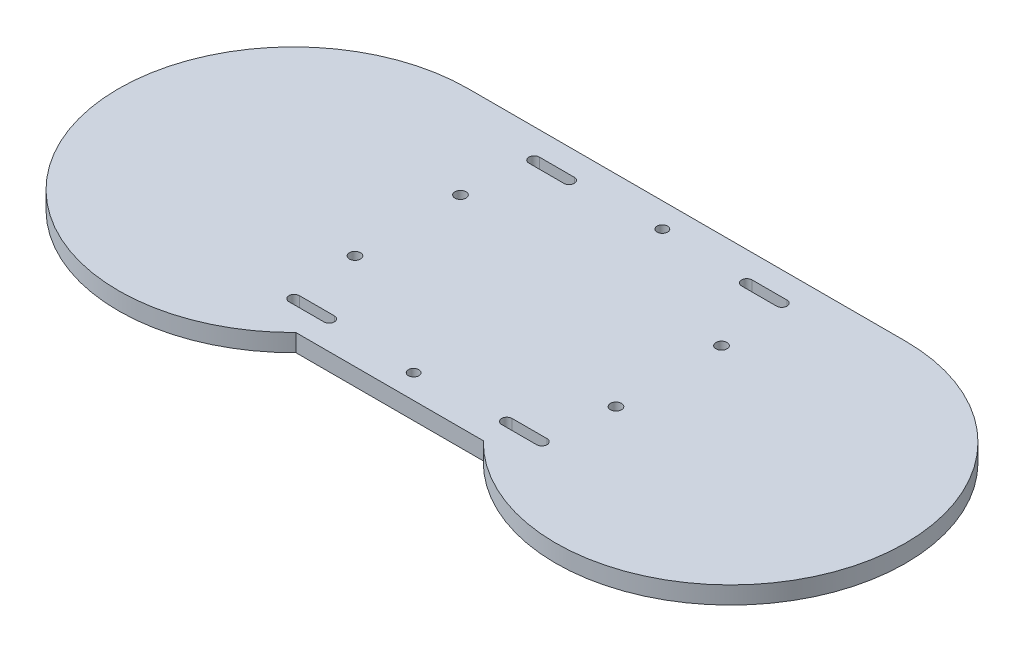
ISO-10303-21;
HEADER;
FILE_DESCRIPTION(('STEP AP214'),'2;1');
FILE_NAME('part.step','',(''),(''),'','','');
FILE_SCHEMA(('AUTOMOTIVE_DESIGN { 1 0 10303 214 1 1 1 1 }'));
ENDSEC;
DATA;
#1=APPLICATION_CONTEXT('core data for automotive mechanical design processes');
#2=APPLICATION_PROTOCOL_DEFINITION('international standard','automotive_design',2000,#1);
#3=PRODUCT_CONTEXT('',#1,'mechanical');
#4=PRODUCT('Part','Part','',(#3));
#5=PRODUCT_RELATED_PRODUCT_CATEGORY('part','',(#4));
#6=PRODUCT_DEFINITION_FORMATION('','',#4);
#7=PRODUCT_DEFINITION_CONTEXT('part definition',#1,'design');
#8=PRODUCT_DEFINITION('design','',#6,#7);
#9=PRODUCT_DEFINITION_SHAPE('','',#8);
#10=(LENGTH_UNIT() NAMED_UNIT(*) SI_UNIT(.MILLI.,.METRE.));
#11=(NAMED_UNIT(*) PLANE_ANGLE_UNIT() SI_UNIT($,.RADIAN.));
#12=(NAMED_UNIT(*) SI_UNIT($,.STERADIAN.) SOLID_ANGLE_UNIT());
#13=UNCERTAINTY_MEASURE_WITH_UNIT(LENGTH_MEASURE(1.E-05),#10,'distance_accuracy_value','');
#14=(GEOMETRIC_REPRESENTATION_CONTEXT(3) GLOBAL_UNCERTAINTY_ASSIGNED_CONTEXT((#13)) GLOBAL_UNIT_ASSIGNED_CONTEXT((#10,
#11,#12)) REPRESENTATION_CONTEXT('',''));
#15=CARTESIAN_POINT('',(0.,0.,0.));
#16=DIRECTION('',(0.,0.,1.));
#17=DIRECTION('',(1.,0.,0.));
#18=AXIS2_PLACEMENT_3D('',#15,#16,#17);
#19=CARTESIAN_POINT('',(-62.5,-13.1875,0.));
#20=DIRECTION('',(0.,-1.,0.));
#21=DIRECTION('',(0.,0.,-1.));
#22=AXIS2_PLACEMENT_3D('',#19,#20,#21);
#23=PLANE('',#22);
#24=DIRECTION('',(1.,0.,0.));
#25=VECTOR('',#24,1.);
#26=CARTESIAN_POINT('',(25.4,-13.1875,-40.2312608372554));
#27=LINE('',#26,#25);
#28=CARTESIAN_POINT('',(35.4,-13.1875,-40.2312608372554));
#29=VERTEX_POINT('',#28);
#30=CARTESIAN_POINT('',(25.4,-13.1875,-40.2312608372554));
#31=VERTEX_POINT('',#30);
#32=EDGE_CURVE('E223',#29,#31,#27,.F.);
#33=ORIENTED_EDGE('',*,*,#32,.F.);
#34=CARTESIAN_POINT('',(35.4,-13.1875,-41.7312608372554));
#35=DIRECTION('',(0.,-1.,0.));
#36=DIRECTION('',(0.,0.,-1.));
#37=AXIS2_PLACEMENT_3D('',#34,#35,#36);
#38=CIRCLE('',#37,1.5);
#39=CARTESIAN_POINT('',(35.4,-13.1875,-43.2312608372554));
#40=VERTEX_POINT('',#39);
#41=EDGE_CURVE('E241',#40,#29,#38,.T.);
#42=ORIENTED_EDGE('',*,*,#41,.F.);
#43=DIRECTION('',(-1.,0.,0.));
#44=VECTOR('',#43,1.);
#45=CARTESIAN_POINT('',(25.4,-13.1875,-43.2312608372554));
#46=LINE('',#45,#44);
#47=CARTESIAN_POINT('',(25.4,-13.1875,-43.2312608372554));
#48=VERTEX_POINT('',#47);
#49=EDGE_CURVE('E225',#48,#40,#46,.F.);
#50=ORIENTED_EDGE('',*,*,#49,.F.);
#51=CARTESIAN_POINT('',(25.4,-13.1875,-41.7312608372554));
#52=DIRECTION('',(0.,1.,0.));
#53=DIRECTION('',(0.,0.,1.));
#54=AXIS2_PLACEMENT_3D('',#51,#52,#53);
#55=CIRCLE('',#54,1.5);
#56=EDGE_CURVE('E47',#48,#31,#55,.T.);
#57=ORIENTED_EDGE('',*,*,#56,.T.);
#58=EDGE_LOOP('',(#33,#42,#50,#57));
#59=FACE_BOUND('',#58,.T.);
#60=DIRECTION('',(1.,0.,0.));
#61=VECTOR('',#60,1.);
#62=CARTESIAN_POINT('',(25.4,-13.1875,28.3687391627446));
#63=LINE('',#62,#61);
#64=CARTESIAN_POINT('',(35.4,-13.1875,28.3687391627446));
#65=VERTEX_POINT('',#64);
#66=CARTESIAN_POINT('',(25.4,-13.1875,28.3687391627446));
#67=VERTEX_POINT('',#66);
#68=EDGE_CURVE('E231',#65,#67,#63,.F.);
#69=ORIENTED_EDGE('',*,*,#68,.F.);
#70=CARTESIAN_POINT('',(35.4,-13.1875,26.8687391627446));
#71=DIRECTION('',(0.,-1.,0.));
#72=DIRECTION('',(0.,0.,-1.));
#73=AXIS2_PLACEMENT_3D('',#70,#71,#72);
#74=CIRCLE('',#73,1.5);
#75=CARTESIAN_POINT('',(35.4,-13.1875,25.3687391627446));
#76=VERTEX_POINT('',#75);
#77=EDGE_CURVE('E233',#76,#65,#74,.T.);
#78=ORIENTED_EDGE('',*,*,#77,.F.);
#79=DIRECTION('',(-1.,0.,0.));
#80=VECTOR('',#79,1.);
#81=CARTESIAN_POINT('',(25.4,-13.1875,25.3687391627446));
#82=LINE('',#81,#80);
#83=CARTESIAN_POINT('',(25.4,-13.1875,25.3687391627446));
#84=VERTEX_POINT('',#83);
#85=EDGE_CURVE('E237',#84,#76,#82,.F.);
#86=ORIENTED_EDGE('',*,*,#85,.F.);
#87=CARTESIAN_POINT('',(25.4,-13.1875,26.8687391627446));
#88=DIRECTION('',(0.,1.,0.));
#89=DIRECTION('',(0.,0.,1.));
#90=AXIS2_PLACEMENT_3D('',#87,#88,#89);
#91=CIRCLE('',#90,1.5);
#92=EDGE_CURVE('E236',#84,#67,#91,.T.);
#93=ORIENTED_EDGE('',*,*,#92,.T.);
#94=EDGE_LOOP('',(#69,#78,#86,#93));
#95=FACE_BOUND('',#94,.T.);
#96=DIRECTION('',(-1.,0.,0.));
#97=VECTOR('',#96,1.);
#98=CARTESIAN_POINT('',(-25.4,-13.1875,25.3687391627446));
#99=LINE('',#98,#97);
#100=CARTESIAN_POINT('',(-35.4,-13.1875,25.3687391627446));
#101=VERTEX_POINT('',#100);
#102=CARTESIAN_POINT('',(-25.4,-13.1875,25.3687391627446));
#103=VERTEX_POINT('',#102);
#104=EDGE_CURVE('E219',#101,#103,#99,.F.);
#105=ORIENTED_EDGE('',*,*,#104,.F.);
#106=CARTESIAN_POINT('',(-35.4,-13.1875,26.8687391627446));
#107=DIRECTION('',(0.,-1.,0.));
#108=DIRECTION('',(0.,0.,-1.));
#109=AXIS2_PLACEMENT_3D('',#106,#107,#108);
#110=CIRCLE('',#109,1.5);
#111=CARTESIAN_POINT('',(-35.4,-13.1875,28.3687391627446));
#112=VERTEX_POINT('',#111);
#113=EDGE_CURVE('E222',#112,#101,#110,.T.);
#114=ORIENTED_EDGE('',*,*,#113,.F.);
#115=DIRECTION('',(1.,0.,0.));
#116=VECTOR('',#115,1.);
#117=CARTESIAN_POINT('',(-25.4,-13.1875,28.3687391627446));
#118=LINE('',#117,#116);
#119=CARTESIAN_POINT('',(-25.4,-13.1875,28.3687391627446));
#120=VERTEX_POINT('',#119);
#121=EDGE_CURVE('E229',#120,#112,#118,.F.);
#122=ORIENTED_EDGE('',*,*,#121,.F.);
#123=CARTESIAN_POINT('',(-25.4,-13.1875,26.8687391627446));
#124=DIRECTION('',(0.,1.,0.));
#125=DIRECTION('',(0.,0.,1.));
#126=AXIS2_PLACEMENT_3D('',#123,#124,#125);
#127=CIRCLE('',#126,1.5);
#128=EDGE_CURVE('E192',#120,#103,#127,.T.);
#129=ORIENTED_EDGE('',*,*,#128,.T.);
#130=EDGE_LOOP('',(#105,#114,#122,#129));
#131=FACE_BOUND('',#130,.T.);
#132=DIRECTION('',(-1.,0.,0.));
#133=VECTOR('',#132,1.);
#134=CARTESIAN_POINT('',(-25.4,-13.1875,-43.2312608372554));
#135=LINE('',#134,#133);
#136=CARTESIAN_POINT('',(-35.4,-13.1875,-43.2312608372554));
#137=VERTEX_POINT('',#136);
#138=CARTESIAN_POINT('',(-25.4,-13.1875,-43.2312608372554));
#139=VERTEX_POINT('',#138);
#140=EDGE_CURVE('E218',#137,#139,#135,.F.);
#141=ORIENTED_EDGE('',*,*,#140,.F.);
#142=CARTESIAN_POINT('',(-35.4,-13.1875,-41.7312608372554));
#143=DIRECTION('',(0.,-1.,0.));
#144=DIRECTION('',(0.,0.,-1.));
#145=AXIS2_PLACEMENT_3D('',#142,#143,#144);
#146=CIRCLE('',#145,1.49999999999999);
#147=CARTESIAN_POINT('',(-35.4,-13.1875,-40.2312608372554));
#148=VERTEX_POINT('',#147);
#149=EDGE_CURVE('E220',#148,#137,#146,.T.);
#150=ORIENTED_EDGE('',*,*,#149,.F.);
#151=DIRECTION('',(1.,0.,0.));
#152=VECTOR('',#151,1.);
#153=CARTESIAN_POINT('',(-25.4,-13.1875,-40.2312608372554));
#154=LINE('',#153,#152);
#155=CARTESIAN_POINT('',(-25.4,-13.1875,-40.2312608372554));
#156=VERTEX_POINT('',#155);
#157=EDGE_CURVE('E216',#156,#148,#154,.F.);
#158=ORIENTED_EDGE('',*,*,#157,.F.);
#159=CARTESIAN_POINT('',(-25.4,-13.1875,-41.7312608372554));
#160=DIRECTION('',(0.,1.,0.));
#161=DIRECTION('',(0.,0.,1.));
#162=AXIS2_PLACEMENT_3D('',#159,#160,#161);
#163=CIRCLE('',#162,1.5);
#164=EDGE_CURVE('E226',#156,#139,#163,.T.);
#165=ORIENTED_EDGE('',*,*,#164,.T.);
#166=EDGE_LOOP('',(#141,#150,#158,#165));
#167=FACE_BOUND('',#166,.T.);
#168=CARTESIAN_POINT('',(0.,-13.1875,-42.9812608372554));
#169=DIRECTION('',(0.,1.,0.));
#170=DIRECTION('',(0.,0.,1.));
#171=AXIS2_PLACEMENT_3D('',#168,#169,#170);
#172=CIRCLE('',#171,1.5);
#173=CARTESIAN_POINT('',(0.,-13.1875,-41.4812608372554));
#174=VERTEX_POINT('',#173);
#175=EDGE_CURVE('E306',#174,#174,#172,.T.);
#176=ORIENTED_EDGE('',*,*,#175,.T.);
#177=EDGE_LOOP('',(#176));
#178=FACE_BOUND('',#177,.T.);
#179=CARTESIAN_POINT('',(0.,-13.1875,28.1187391627446));
#180=DIRECTION('',(0.,1.,0.));
#181=DIRECTION('',(0.,0.,1.));
#182=AXIS2_PLACEMENT_3D('',#179,#180,#181);
#183=CIRCLE('',#182,1.5);
#184=CARTESIAN_POINT('',(0.,-13.1875,29.6187391627446));
#185=VERTEX_POINT('',#184);
#186=EDGE_CURVE('E245',#185,#185,#183,.T.);
#187=ORIENTED_EDGE('',*,*,#186,.T.);
#188=EDGE_LOOP('',(#187));
#189=FACE_BOUND('',#188,.T.);
#190=CARTESIAN_POINT('',(37.30625,-13.1875,-22.58125));
#191=DIRECTION('',(0.,-1.,0.));
#192=DIRECTION('',(0.,0.,-1.));
#193=AXIS2_PLACEMENT_3D('',#190,#191,#192);
#194=CIRCLE('',#193,1.5875);
#195=CARTESIAN_POINT('',(37.30625,-13.1875,-24.16875));
#196=VERTEX_POINT('',#195);
#197=EDGE_CURVE('E317',#196,#196,#194,.T.);
#198=ORIENTED_EDGE('',*,*,#197,.F.);
#199=EDGE_LOOP('',(#198));
#200=FACE_BOUND('',#199,.T.);
#201=CARTESIAN_POINT('',(-37.30625,-13.1875,7.58125));
#202=DIRECTION('',(0.,-1.,0.));
#203=DIRECTION('',(0.,0.,-1.));
#204=AXIS2_PLACEMENT_3D('',#201,#202,#203);
#205=CIRCLE('',#204,1.5875);
#206=CARTESIAN_POINT('',(-37.30625,-13.1875,5.99375));
#207=VERTEX_POINT('',#206);
#208=EDGE_CURVE('E329',#207,#207,#205,.T.);
#209=ORIENTED_EDGE('',*,*,#208,.F.);
#210=EDGE_LOOP('',(#209));
#211=FACE_BOUND('',#210,.T.);
#212=CARTESIAN_POINT('',(-62.5,-13.1875,0.));
#213=DIRECTION('',(0.,-1.,0.));
#214=DIRECTION('',(0.,0.,-1.));
#215=AXIS2_PLACEMENT_3D('',#212,#213,#214);
#216=CIRCLE('',#215,50.);
#217=CARTESIAN_POINT('',(-26.7928578572857,-13.1875,35.));
#218=VERTEX_POINT('',#217);
#219=CARTESIAN_POINT('',(-62.5,-13.1875,-50.));
#220=VERTEX_POINT('',#219);
#221=EDGE_CURVE('E335',#218,#220,#216,.T.);
#222=ORIENTED_EDGE('',*,*,#221,.T.);
#223=DIRECTION('',(1.,0.,0.));
#224=VECTOR('',#223,1.);
#225=CARTESIAN_POINT('',(-62.5,-13.1875,-50.));
#226=LINE('',#225,#224);
#227=CARTESIAN_POINT('',(62.5,-13.1875,-50.));
#228=VERTEX_POINT('',#227);
#229=EDGE_CURVE('E338',#220,#228,#226,.T.);
#230=ORIENTED_EDGE('',*,*,#229,.T.);
#231=CARTESIAN_POINT('',(62.5,-13.1875,0.));
#232=DIRECTION('',(0.,-1.,0.));
#233=DIRECTION('',(0.,0.,-1.));
#234=AXIS2_PLACEMENT_3D('',#231,#232,#233);
#235=CIRCLE('',#234,50.);
#236=CARTESIAN_POINT('',(26.7928578572857,-13.1875,35.));
#237=VERTEX_POINT('',#236);
#238=EDGE_CURVE('E341',#228,#237,#235,.T.);
#239=ORIENTED_EDGE('',*,*,#238,.T.);
#240=DIRECTION('',(-1.,0.,0.));
#241=VECTOR('',#240,1.);
#242=CARTESIAN_POINT('',(-26.7928578572857,-13.1875,35.));
#243=LINE('',#242,#241);
#244=EDGE_CURVE('E343',#237,#218,#243,.T.);
#245=ORIENTED_EDGE('',*,*,#244,.T.);
#246=EDGE_LOOP('',(#222,#230,#239,#245));
#247=FACE_BOUND('',#246,.T.);
#248=CARTESIAN_POINT('',(37.30625,-13.1875,7.58125));
#249=DIRECTION('',(0.,-1.,0.));
#250=DIRECTION('',(0.,0.,-1.));
#251=AXIS2_PLACEMENT_3D('',#248,#249,#250);
#252=CIRCLE('',#251,1.5875);
#253=CARTESIAN_POINT('',(37.30625,-13.1875,5.99375));
#254=VERTEX_POINT('',#253);
#255=EDGE_CURVE('E323',#254,#254,#252,.T.);
#256=ORIENTED_EDGE('',*,*,#255,.F.);
#257=EDGE_LOOP('',(#256));
#258=FACE_BOUND('',#257,.T.);
#259=CARTESIAN_POINT('',(-37.30625,-13.1875,-22.58125));
#260=DIRECTION('',(0.,-1.,0.));
#261=DIRECTION('',(0.,0.,-1.));
#262=AXIS2_PLACEMENT_3D('',#259,#260,#261);
#263=CIRCLE('',#262,1.5875);
#264=CARTESIAN_POINT('',(-37.30625,-13.1875,-24.16875));
#265=VERTEX_POINT('',#264);
#266=EDGE_CURVE('E311',#265,#265,#263,.T.);
#267=ORIENTED_EDGE('',*,*,#266,.F.);
#268=EDGE_LOOP('',(#267));
#269=FACE_BOUND('',#268,.T.);
#270=ADVANCED_FACE('F43',(#59,#95,#131,#167,#178,#189,#200,#211,#247,#258,#269),#23,.T.);
#271=CARTESIAN_POINT('',(-62.5,-8.1875,0.));
#272=DIRECTION('',(0.,-1.,0.));
#273=DIRECTION('',(0.,0.,-1.));
#274=AXIS2_PLACEMENT_3D('',#271,#272,#273);
#275=PLANE('',#274);
#276=CARTESIAN_POINT('',(0.,-8.1875,-42.9812608372554));
#277=DIRECTION('',(0.,-1.,0.));
#278=DIRECTION('',(0.,0.,-1.));
#279=AXIS2_PLACEMENT_3D('',#276,#277,#278);
#280=CIRCLE('',#279,1.5);
#281=CARTESIAN_POINT('',(0.,-8.1875,-41.4812608372554));
#282=VERTEX_POINT('',#281);
#283=EDGE_CURVE('E212',#282,#282,#280,.T.);
#284=ORIENTED_EDGE('',*,*,#283,.T.);
#285=EDGE_LOOP('',(#284));
#286=FACE_BOUND('',#285,.T.);
#287=CARTESIAN_POINT('',(0.,-8.1875,28.1187391627446));
#288=DIRECTION('',(0.,-1.,0.));
#289=DIRECTION('',(0.,0.,-1.));
#290=AXIS2_PLACEMENT_3D('',#287,#288,#289);
#291=CIRCLE('',#290,1.5);
#292=CARTESIAN_POINT('',(0.,-8.1875,29.6187391627446));
#293=VERTEX_POINT('',#292);
#294=EDGE_CURVE('E203',#293,#293,#291,.T.);
#295=ORIENTED_EDGE('',*,*,#294,.T.);
#296=EDGE_LOOP('',(#295));
#297=FACE_BOUND('',#296,.T.);
#298=CARTESIAN_POINT('',(35.4,-8.1875,26.8687391627446));
#299=DIRECTION('',(0.,-1.,0.));
#300=DIRECTION('',(0.,0.,-1.));
#301=AXIS2_PLACEMENT_3D('',#298,#299,#300);
#302=CIRCLE('',#301,1.5);
#303=CARTESIAN_POINT('',(35.4,-8.1875,28.3687391627446));
#304=VERTEX_POINT('',#303);
#305=CARTESIAN_POINT('',(35.4,-8.1875,25.3687391627446));
#306=VERTEX_POINT('',#305);
#307=EDGE_CURVE('E274',#304,#306,#302,.F.);
#308=ORIENTED_EDGE('',*,*,#307,.F.);
#309=DIRECTION('',(1.,0.,0.));
#310=VECTOR('',#309,1.);
#311=CARTESIAN_POINT('',(25.4,-8.1875,28.3687391627446));
#312=LINE('',#311,#310);
#313=CARTESIAN_POINT('',(25.4,-8.1875,28.3687391627446));
#314=VERTEX_POINT('',#313);
#315=EDGE_CURVE('E674',#314,#304,#312,.T.);
#316=ORIENTED_EDGE('',*,*,#315,.F.);
#317=CARTESIAN_POINT('',(25.4,-8.1875,26.8687391627446));
#318=DIRECTION('',(0.,-1.,0.));
#319=DIRECTION('',(0.,0.,-1.));
#320=AXIS2_PLACEMENT_3D('',#317,#318,#319);
#321=CIRCLE('',#320,1.5);
#322=CARTESIAN_POINT('',(25.4,-8.1875,25.3687391627446));
#323=VERTEX_POINT('',#322);
#324=EDGE_CURVE('E199',#314,#323,#321,.T.);
#325=ORIENTED_EDGE('',*,*,#324,.T.);
#326=DIRECTION('',(-1.,0.,0.));
#327=VECTOR('',#326,1.);
#328=CARTESIAN_POINT('',(25.4,-8.1875,25.3687391627446));
#329=LINE('',#328,#327);
#330=EDGE_CURVE('E270',#306,#323,#329,.T.);
#331=ORIENTED_EDGE('',*,*,#330,.F.);
#332=EDGE_LOOP('',(#308,#316,#325,#331));
#333=FACE_BOUND('',#332,.T.);
#334=CARTESIAN_POINT('',(-35.4,-8.1875,26.8687391627446));
#335=DIRECTION('',(0.,-1.,0.));
#336=DIRECTION('',(0.,0.,-1.));
#337=AXIS2_PLACEMENT_3D('',#334,#335,#336);
#338=CIRCLE('',#337,1.5);
#339=CARTESIAN_POINT('',(-35.4,-8.1875,25.3687391627446));
#340=VERTEX_POINT('',#339);
#341=CARTESIAN_POINT('',(-35.4,-8.1875,28.3687391627446));
#342=VERTEX_POINT('',#341);
#343=EDGE_CURVE('E302',#340,#342,#338,.F.);
#344=ORIENTED_EDGE('',*,*,#343,.F.);
#345=DIRECTION('',(-1.,0.,0.));
#346=VECTOR('',#345,1.);
#347=CARTESIAN_POINT('',(-25.4,-8.1875,25.3687391627446));
#348=LINE('',#347,#346);
#349=CARTESIAN_POINT('',(-25.4,-8.1875,25.3687391627446));
#350=VERTEX_POINT('',#349);
#351=EDGE_CURVE('E181',#350,#340,#348,.T.);
#352=ORIENTED_EDGE('',*,*,#351,.F.);
#353=CARTESIAN_POINT('',(-25.4,-8.1875,26.8687391627446));
#354=DIRECTION('',(0.,-1.,0.));
#355=DIRECTION('',(0.,0.,-1.));
#356=AXIS2_PLACEMENT_3D('',#353,#354,#355);
#357=CIRCLE('',#356,1.5);
#358=CARTESIAN_POINT('',(-25.4,-8.1875,28.3687391627446));
#359=VERTEX_POINT('',#358);
#360=EDGE_CURVE('E190',#350,#359,#357,.T.);
#361=ORIENTED_EDGE('',*,*,#360,.T.);
#362=DIRECTION('',(1.,0.,0.));
#363=VECTOR('',#362,1.);
#364=CARTESIAN_POINT('',(-25.4,-8.1875,28.3687391627446));
#365=LINE('',#364,#363);
#366=EDGE_CURVE('E171',#342,#359,#365,.T.);
#367=ORIENTED_EDGE('',*,*,#366,.F.);
#368=EDGE_LOOP('',(#344,#352,#361,#367));
#369=FACE_BOUND('',#368,.T.);
#370=CARTESIAN_POINT('',(-35.4,-8.1875,-41.7312608372554));
#371=DIRECTION('',(0.,-1.,0.));
#372=DIRECTION('',(0.,0.,-1.));
#373=AXIS2_PLACEMENT_3D('',#370,#371,#372);
#374=CIRCLE('',#373,1.49999999999999);
#375=CARTESIAN_POINT('',(-35.4,-8.1875,-43.2312608372554));
#376=VERTEX_POINT('',#375);
#377=CARTESIAN_POINT('',(-35.4,-8.1875,-40.2312608372554));
#378=VERTEX_POINT('',#377);
#379=EDGE_CURVE('E281',#376,#378,#374,.F.);
#380=ORIENTED_EDGE('',*,*,#379,.F.);
#381=DIRECTION('',(-1.,0.,0.));
#382=VECTOR('',#381,1.);
#383=CARTESIAN_POINT('',(-25.4,-8.1875,-43.2312608372554));
#384=LINE('',#383,#382);
#385=CARTESIAN_POINT('',(-25.4,-8.1875,-43.2312608372554));
#386=VERTEX_POINT('',#385);
#387=EDGE_CURVE('E283',#386,#376,#384,.T.);
#388=ORIENTED_EDGE('',*,*,#387,.F.);
#389=CARTESIAN_POINT('',(-25.4,-8.1875,-41.7312608372554));
#390=DIRECTION('',(0.,-1.,0.));
#391=DIRECTION('',(0.,0.,-1.));
#392=AXIS2_PLACEMENT_3D('',#389,#390,#391);
#393=CIRCLE('',#392,1.5);
#394=CARTESIAN_POINT('',(-25.4,-8.1875,-40.2312608372554));
#395=VERTEX_POINT('',#394);
#396=EDGE_CURVE('E200',#386,#395,#393,.T.);
#397=ORIENTED_EDGE('',*,*,#396,.T.);
#398=DIRECTION('',(1.,0.,0.));
#399=VECTOR('',#398,1.);
#400=CARTESIAN_POINT('',(-25.4,-8.1875,-40.2312608372554));
#401=LINE('',#400,#399);
#402=EDGE_CURVE('E239',#378,#395,#401,.T.);
#403=ORIENTED_EDGE('',*,*,#402,.F.);
#404=EDGE_LOOP('',(#380,#388,#397,#403));
#405=FACE_BOUND('',#404,.T.);
#406=CARTESIAN_POINT('',(35.4,-8.1875,-41.7312608372554));
#407=DIRECTION('',(0.,-1.,0.));
#408=DIRECTION('',(0.,0.,-1.));
#409=AXIS2_PLACEMENT_3D('',#406,#407,#408);
#410=CIRCLE('',#409,1.5);
#411=CARTESIAN_POINT('',(35.4,-8.1875,-40.2312608372554));
#412=VERTEX_POINT('',#411);
#413=CARTESIAN_POINT('',(35.4,-8.1875,-43.2312608372554));
#414=VERTEX_POINT('',#413);
#415=EDGE_CURVE('E129',#412,#414,#410,.F.);
#416=ORIENTED_EDGE('',*,*,#415,.F.);
#417=DIRECTION('',(1.,0.,0.));
#418=VECTOR('',#417,1.);
#419=CARTESIAN_POINT('',(25.4,-8.1875,-40.2312608372554));
#420=LINE('',#419,#418);
#421=CARTESIAN_POINT('',(25.4,-8.1875,-40.2312608372554));
#422=VERTEX_POINT('',#421);
#423=EDGE_CURVE('E278',#422,#412,#420,.T.);
#424=ORIENTED_EDGE('',*,*,#423,.F.);
#425=CARTESIAN_POINT('',(25.4,-8.1875,-41.7312608372554));
#426=DIRECTION('',(0.,-1.,0.));
#427=DIRECTION('',(0.,0.,-1.));
#428=AXIS2_PLACEMENT_3D('',#425,#426,#427);
#429=CIRCLE('',#428,1.5);
#430=CARTESIAN_POINT('',(25.4,-8.1875,-43.2312608372554));
#431=VERTEX_POINT('',#430);
#432=EDGE_CURVE('E206',#422,#431,#429,.T.);
#433=ORIENTED_EDGE('',*,*,#432,.T.);
#434=DIRECTION('',(-1.,0.,0.));
#435=VECTOR('',#434,1.);
#436=CARTESIAN_POINT('',(25.4,-8.1875,-43.2312608372554));
#437=LINE('',#436,#435);
#438=EDGE_CURVE('E62',#414,#431,#437,.T.);
#439=ORIENTED_EDGE('',*,*,#438,.F.);
#440=EDGE_LOOP('',(#416,#424,#433,#439));
#441=FACE_BOUND('',#440,.T.);
#442=CARTESIAN_POINT('',(-62.5,-8.1875,0.));
#443=DIRECTION('',(0.,-1.,0.));
#444=DIRECTION('',(0.,0.,-1.));
#445=AXIS2_PLACEMENT_3D('',#442,#443,#444);
#446=CIRCLE('',#445,50.);
#447=CARTESIAN_POINT('',(-26.7928578572857,-8.1875,35.));
#448=VERTEX_POINT('',#447);
#449=CARTESIAN_POINT('',(-62.5,-8.1875,-50.));
#450=VERTEX_POINT('',#449);
#451=EDGE_CURVE('E332',#448,#450,#446,.T.);
#452=ORIENTED_EDGE('',*,*,#451,.F.);
#453=DIRECTION('',(-1.,0.,0.));
#454=VECTOR('',#453,1.);
#455=CARTESIAN_POINT('',(-26.7928578572857,-8.1875,35.));
#456=LINE('',#455,#454);
#457=CARTESIAN_POINT('',(26.7928578572857,-8.1875,35.));
#458=VERTEX_POINT('',#457);
#459=EDGE_CURVE('E339',#458,#448,#456,.T.);
#460=ORIENTED_EDGE('',*,*,#459,.F.);
#461=CARTESIAN_POINT('',(62.5,-8.1875,0.));
#462=DIRECTION('',(0.,-1.,0.));
#463=DIRECTION('',(0.,0.,-1.));
#464=AXIS2_PLACEMENT_3D('',#461,#462,#463);
#465=CIRCLE('',#464,50.);
#466=CARTESIAN_POINT('',(62.5,-8.1875,-50.));
#467=VERTEX_POINT('',#466);
#468=EDGE_CURVE('E350',#467,#458,#465,.T.);
#469=ORIENTED_EDGE('',*,*,#468,.F.);
#470=DIRECTION('',(1.,0.,0.));
#471=VECTOR('',#470,1.);
#472=CARTESIAN_POINT('',(-62.5,-8.1875,-50.));
#473=LINE('',#472,#471);
#474=EDGE_CURVE('E348',#450,#467,#473,.T.);
#475=ORIENTED_EDGE('',*,*,#474,.F.);
#476=EDGE_LOOP('',(#452,#460,#469,#475));
#477=FACE_BOUND('',#476,.T.);
#478=CARTESIAN_POINT('',(-37.30625,-8.1875,7.58125));
#479=DIRECTION('',(0.,-1.,0.));
#480=DIRECTION('',(0.,0.,-1.));
#481=AXIS2_PLACEMENT_3D('',#478,#479,#480);
#482=CIRCLE('',#481,1.5875);
#483=CARTESIAN_POINT('',(-37.30625,-8.1875,5.99375));
#484=VERTEX_POINT('',#483);
#485=EDGE_CURVE('E326',#484,#484,#482,.T.);
#486=ORIENTED_EDGE('',*,*,#485,.T.);
#487=EDGE_LOOP('',(#486));
#488=FACE_BOUND('',#487,.T.);
#489=CARTESIAN_POINT('',(37.30625,-8.1875,7.58125));
#490=DIRECTION('',(0.,-1.,0.));
#491=DIRECTION('',(0.,0.,-1.));
#492=AXIS2_PLACEMENT_3D('',#489,#490,#491);
#493=CIRCLE('',#492,1.5875);
#494=CARTESIAN_POINT('',(37.30625,-8.1875,5.99375));
#495=VERTEX_POINT('',#494);
#496=EDGE_CURVE('E320',#495,#495,#493,.T.);
#497=ORIENTED_EDGE('',*,*,#496,.T.);
#498=EDGE_LOOP('',(#497));
#499=FACE_BOUND('',#498,.T.);
#500=CARTESIAN_POINT('',(37.30625,-8.1875,-22.58125));
#501=DIRECTION('',(0.,-1.,0.));
#502=DIRECTION('',(0.,0.,-1.));
#503=AXIS2_PLACEMENT_3D('',#500,#501,#502);
#504=CIRCLE('',#503,1.5875);
#505=CARTESIAN_POINT('',(37.30625,-8.1875,-24.16875));
#506=VERTEX_POINT('',#505);
#507=EDGE_CURVE('E314',#506,#506,#504,.T.);
#508=ORIENTED_EDGE('',*,*,#507,.T.);
#509=EDGE_LOOP('',(#508));
#510=FACE_BOUND('',#509,.T.);
#511=CARTESIAN_POINT('',(-37.30625,-8.1875,-22.58125));
#512=DIRECTION('',(0.,-1.,0.));
#513=DIRECTION('',(0.,0.,-1.));
#514=AXIS2_PLACEMENT_3D('',#511,#512,#513);
#515=CIRCLE('',#514,1.5875);
#516=CARTESIAN_POINT('',(-37.30625,-8.1875,-24.16875));
#517=VERTEX_POINT('',#516);
#518=EDGE_CURVE('E215',#517,#517,#515,.T.);
#519=ORIENTED_EDGE('',*,*,#518,.T.);
#520=EDGE_LOOP('',(#519));
#521=FACE_BOUND('',#520,.T.);
#522=ADVANCED_FACE('F196',(#286,#297,#333,#369,#405,#441,#477,#488,#499,#510,#521),#275,.F.);
#523=CARTESIAN_POINT('',(-62.5,-13.1875,0.));
#524=DIRECTION('',(0.,1.,0.));
#525=DIRECTION('',(0.,0.,1.));
#526=AXIS2_PLACEMENT_3D('',#523,#524,#525);
#527=CYLINDRICAL_SURFACE('',#526,50.);
#528=ORIENTED_EDGE('',*,*,#451,.T.);
#529=DIRECTION('',(0.,1.,0.));
#530=VECTOR('',#529,1.);
#531=CARTESIAN_POINT('',(-62.5,-13.1875,-50.));
#532=LINE('',#531,#530);
#533=EDGE_CURVE('E11',#220,#450,#532,.T.);
#534=ORIENTED_EDGE('',*,*,#533,.F.);
#535=ORIENTED_EDGE('',*,*,#221,.F.);
#536=DIRECTION('',(0.,1.,0.));
#537=VECTOR('',#536,1.);
#538=CARTESIAN_POINT('',(-26.7928578572857,-13.1875,35.));
#539=LINE('',#538,#537);
#540=EDGE_CURVE('E345',#218,#448,#539,.T.);
#541=ORIENTED_EDGE('',*,*,#540,.T.);
#542=EDGE_LOOP('',(#528,#534,#535,#541));
#543=FACE_BOUND('',#542,.T.);
#544=ADVANCED_FACE('F45',(#543),#527,.T.);
#545=CARTESIAN_POINT('',(-62.5,-13.1875,-50.));
#546=DIRECTION('',(0.,0.,1.));
#547=DIRECTION('',(1.,0.,0.));
#548=AXIS2_PLACEMENT_3D('',#545,#546,#547);
#549=PLANE('',#548);
#550=ORIENTED_EDGE('',*,*,#474,.T.);
#551=DIRECTION('',(0.,1.,0.));
#552=VECTOR('',#551,1.);
#553=CARTESIAN_POINT('',(62.5,-13.1875,-50.));
#554=LINE('',#553,#552);
#555=EDGE_CURVE('E53',#228,#467,#554,.T.);
#556=ORIENTED_EDGE('',*,*,#555,.F.);
#557=ORIENTED_EDGE('',*,*,#229,.F.);
#558=ORIENTED_EDGE('',*,*,#533,.T.);
#559=EDGE_LOOP('',(#550,#556,#557,#558));
#560=FACE_BOUND('',#559,.T.);
#561=ADVANCED_FACE('F405',(#560),#549,.F.);
#562=CARTESIAN_POINT('',(62.5,-13.1875,0.));
#563=DIRECTION('',(0.,1.,0.));
#564=DIRECTION('',(0.,0.,1.));
#565=AXIS2_PLACEMENT_3D('',#562,#563,#564);
#566=CYLINDRICAL_SURFACE('',#565,50.);
#567=ORIENTED_EDGE('',*,*,#468,.T.);
#568=DIRECTION('',(0.,1.,0.));
#569=VECTOR('',#568,1.);
#570=CARTESIAN_POINT('',(26.7928578572857,-13.1875,35.));
#571=LINE('',#570,#569);
#572=EDGE_CURVE('E355',#237,#458,#571,.T.);
#573=ORIENTED_EDGE('',*,*,#572,.F.);
#574=ORIENTED_EDGE('',*,*,#238,.F.);
#575=ORIENTED_EDGE('',*,*,#555,.T.);
#576=EDGE_LOOP('',(#567,#573,#574,#575));
#577=FACE_BOUND('',#576,.T.);
#578=ADVANCED_FACE('F402',(#577),#566,.T.);
#579=CARTESIAN_POINT('',(-26.7928578572857,-13.1875,35.));
#580=DIRECTION('',(0.,0.,-1.));
#581=DIRECTION('',(-1.,0.,0.));
#582=AXIS2_PLACEMENT_3D('',#579,#580,#581);
#583=PLANE('',#582);
#584=ORIENTED_EDGE('',*,*,#459,.T.);
#585=ORIENTED_EDGE('',*,*,#540,.F.);
#586=ORIENTED_EDGE('',*,*,#244,.F.);
#587=ORIENTED_EDGE('',*,*,#572,.T.);
#588=EDGE_LOOP('',(#584,#585,#586,#587));
#589=FACE_BOUND('',#588,.T.);
#590=ADVANCED_FACE('F399',(#589),#583,.F.);
#591=CARTESIAN_POINT('',(-37.30625,-13.1875,7.58125));
#592=DIRECTION('',(0.,1.,0.));
#593=DIRECTION('',(0.,0.,1.));
#594=AXIS2_PLACEMENT_3D('',#591,#592,#593);
#595=CYLINDRICAL_SURFACE('',#594,1.5875);
#596=ORIENTED_EDGE('',*,*,#208,.T.);
#597=EDGE_LOOP('',(#596));
#598=FACE_BOUND('',#597,.T.);
#599=ORIENTED_EDGE('',*,*,#485,.F.);
#600=EDGE_LOOP('',(#599));
#601=FACE_BOUND('',#600,.T.);
#602=ADVANCED_FACE('F396',(#598,#601),#595,.F.);
#603=CARTESIAN_POINT('',(37.30625,-13.1875,7.58125));
#604=DIRECTION('',(0.,1.,0.));
#605=DIRECTION('',(0.,0.,1.));
#606=AXIS2_PLACEMENT_3D('',#603,#604,#605);
#607=CYLINDRICAL_SURFACE('',#606,1.5875);
#608=ORIENTED_EDGE('',*,*,#255,.T.);
#609=EDGE_LOOP('',(#608));
#610=FACE_BOUND('',#609,.T.);
#611=ORIENTED_EDGE('',*,*,#496,.F.);
#612=EDGE_LOOP('',(#611));
#613=FACE_BOUND('',#612,.T.);
#614=ADVANCED_FACE('F387',(#610,#613),#607,.F.);
#615=CARTESIAN_POINT('',(37.30625,-13.1875,-22.58125));
#616=DIRECTION('',(0.,1.,0.));
#617=DIRECTION('',(0.,0.,1.));
#618=AXIS2_PLACEMENT_3D('',#615,#616,#617);
#619=CYLINDRICAL_SURFACE('',#618,1.5875);
#620=ORIENTED_EDGE('',*,*,#197,.T.);
#621=EDGE_LOOP('',(#620));
#622=FACE_BOUND('',#621,.T.);
#623=ORIENTED_EDGE('',*,*,#507,.F.);
#624=EDGE_LOOP('',(#623));
#625=FACE_BOUND('',#624,.T.);
#626=ADVANCED_FACE('F377',(#622,#625),#619,.F.);
#627=CARTESIAN_POINT('',(-37.30625,-13.1875,-22.58125));
#628=DIRECTION('',(0.,1.,0.));
#629=DIRECTION('',(0.,0.,1.));
#630=AXIS2_PLACEMENT_3D('',#627,#628,#629);
#631=CYLINDRICAL_SURFACE('',#630,1.5875);
#632=ORIENTED_EDGE('',*,*,#266,.T.);
#633=EDGE_LOOP('',(#632));
#634=FACE_BOUND('',#633,.T.);
#635=ORIENTED_EDGE('',*,*,#518,.F.);
#636=EDGE_LOOP('',(#635));
#637=FACE_BOUND('',#636,.T.);
#638=ADVANCED_FACE('F375',(#634,#637),#631,.F.);
#639=CARTESIAN_POINT('',(25.4,-13.1875,-41.7312608372554));
#640=DIRECTION('',(0.,1.,0.));
#641=DIRECTION('',(0.,0.,1.));
#642=AXIS2_PLACEMENT_3D('',#639,#640,#641);
#643=CYLINDRICAL_SURFACE('',#642,1.5);
#644=ORIENTED_EDGE('',*,*,#432,.F.);
#645=DIRECTION('',(0.,-1.,0.));
#646=VECTOR('',#645,1.);
#647=CARTESIAN_POINT('',(25.4,5.15416406412633,-40.2312608372554));
#648=LINE('',#647,#646);
#649=EDGE_CURVE('E253',#422,#31,#648,.T.);
#650=ORIENTED_EDGE('',*,*,#649,.T.);
#651=ORIENTED_EDGE('',*,*,#56,.F.);
#652=DIRECTION('',(0.,-1.,0.));
#653=VECTOR('',#652,1.);
#654=CARTESIAN_POINT('',(25.4,5.15416406412633,-43.2312608372554));
#655=LINE('',#654,#653);
#656=EDGE_CURVE('E118',#431,#48,#655,.T.);
#657=ORIENTED_EDGE('',*,*,#656,.F.);
#658=EDGE_LOOP('',(#644,#650,#651,#657));
#659=FACE_BOUND('',#658,.T.);
#660=ADVANCED_FACE('F262',(#659),#643,.F.);
#661=CARTESIAN_POINT('',(-25.4,-13.1875,-41.7312608372554));
#662=DIRECTION('',(0.,1.,0.));
#663=DIRECTION('',(0.,0.,1.));
#664=AXIS2_PLACEMENT_3D('',#661,#662,#663);
#665=CYLINDRICAL_SURFACE('',#664,1.5);
#666=ORIENTED_EDGE('',*,*,#396,.F.);
#667=DIRECTION('',(0.,-1.,0.));
#668=VECTOR('',#667,1.);
#669=CARTESIAN_POINT('',(-25.4,5.15416406412633,-43.2312608372554));
#670=LINE('',#669,#668);
#671=EDGE_CURVE('E284',#386,#139,#670,.T.);
#672=ORIENTED_EDGE('',*,*,#671,.T.);
#673=ORIENTED_EDGE('',*,*,#164,.F.);
#674=DIRECTION('',(0.,-1.,0.));
#675=VECTOR('',#674,1.);
#676=CARTESIAN_POINT('',(-25.4,5.15416406412633,-40.2312608372554));
#677=LINE('',#676,#675);
#678=EDGE_CURVE('E193',#395,#156,#677,.T.);
#679=ORIENTED_EDGE('',*,*,#678,.F.);
#680=EDGE_LOOP('',(#666,#672,#673,#679));
#681=FACE_BOUND('',#680,.T.);
#682=ADVANCED_FACE('F385',(#681),#665,.F.);
#683=CARTESIAN_POINT('',(-25.4,-13.1875,26.8687391627446));
#684=DIRECTION('',(0.,1.,0.));
#685=DIRECTION('',(0.,0.,1.));
#686=AXIS2_PLACEMENT_3D('',#683,#684,#685);
#687=CYLINDRICAL_SURFACE('',#686,1.5);
#688=ORIENTED_EDGE('',*,*,#360,.F.);
#689=DIRECTION('',(0.,-1.,0.));
#690=VECTOR('',#689,1.);
#691=CARTESIAN_POINT('',(-25.4,5.15416406412633,25.3687391627446));
#692=LINE('',#691,#690);
#693=EDGE_CURVE('E299',#350,#103,#692,.T.);
#694=ORIENTED_EDGE('',*,*,#693,.T.);
#695=ORIENTED_EDGE('',*,*,#128,.F.);
#696=DIRECTION('',(0.,-1.,0.));
#697=VECTOR('',#696,1.);
#698=CARTESIAN_POINT('',(-25.4,5.15416406412633,28.3687391627446));
#699=LINE('',#698,#697);
#700=EDGE_CURVE('E174',#359,#120,#699,.T.);
#701=ORIENTED_EDGE('',*,*,#700,.F.);
#702=EDGE_LOOP('',(#688,#694,#695,#701));
#703=FACE_BOUND('',#702,.T.);
#704=ADVANCED_FACE('F187',(#703),#687,.F.);
#705=CARTESIAN_POINT('',(25.4,-13.1875,26.8687391627446));
#706=DIRECTION('',(0.,1.,0.));
#707=DIRECTION('',(0.,0.,1.));
#708=AXIS2_PLACEMENT_3D('',#705,#706,#707);
#709=CYLINDRICAL_SURFACE('',#708,1.5);
#710=ORIENTED_EDGE('',*,*,#324,.F.);
#711=DIRECTION('',(0.,-1.,0.));
#712=VECTOR('',#711,1.);
#713=CARTESIAN_POINT('',(25.4,5.15416406412633,28.3687391627446));
#714=LINE('',#713,#712);
#715=EDGE_CURVE('E295',#314,#67,#714,.T.);
#716=ORIENTED_EDGE('',*,*,#715,.T.);
#717=ORIENTED_EDGE('',*,*,#92,.F.);
#718=DIRECTION('',(0.,-1.,0.));
#719=VECTOR('',#718,1.);
#720=CARTESIAN_POINT('',(25.4,5.15416406412633,25.3687391627446));
#721=LINE('',#720,#719);
#722=EDGE_CURVE('E182',#323,#84,#721,.T.);
#723=ORIENTED_EDGE('',*,*,#722,.F.);
#724=EDGE_LOOP('',(#710,#716,#717,#723));
#725=FACE_BOUND('',#724,.T.);
#726=ADVANCED_FACE('F479',(#725),#709,.F.);
#727=CARTESIAN_POINT('',(0.,-13.1875,28.1187391627446));
#728=DIRECTION('',(0.,1.,0.));
#729=DIRECTION('',(0.,0.,1.));
#730=AXIS2_PLACEMENT_3D('',#727,#728,#729);
#731=CYLINDRICAL_SURFACE('',#730,1.5);
#732=CARTESIAN_POINT('',(0.,-13.1875,29.6187391627446));
#733=CARTESIAN_POINT('',(0.,-13.1354166666667,29.6187391627446));
#734=CARTESIAN_POINT('',(0.,-13.0833333333333,29.6187391627446));
#735=CARTESIAN_POINT('',(0.,-12.9791666666667,29.6187391627446));
#736=CARTESIAN_POINT('',(0.,-12.9270833333333,29.6187391627446));
#737=CARTESIAN_POINT('',(0.,-12.8229166666667,29.6187391627446));
#738=CARTESIAN_POINT('',(0.,-12.7708333333333,29.6187391627446));
#739=CARTESIAN_POINT('',(0.,-12.6666666666667,29.6187391627446));
#740=CARTESIAN_POINT('',(0.,-12.6145833333333,29.6187391627446));
#741=CARTESIAN_POINT('',(0.,-12.5104166666667,29.6187391627446));
#742=CARTESIAN_POINT('',(0.,-12.4583333333333,29.6187391627446));
#743=CARTESIAN_POINT('',(0.,-12.3541666666667,29.6187391627446));
#744=CARTESIAN_POINT('',(0.,-12.3020833333333,29.6187391627446));
#745=CARTESIAN_POINT('',(0.,-12.1979166666667,29.6187391627446));
#746=CARTESIAN_POINT('',(0.,-12.1458333333333,29.6187391627446));
#747=CARTESIAN_POINT('',(0.,-12.0416666666667,29.6187391627446));
#748=CARTESIAN_POINT('',(0.,-11.9895833333333,29.6187391627446));
#749=CARTESIAN_POINT('',(0.,-11.8854166666667,29.6187391627446));
#750=CARTESIAN_POINT('',(0.,-11.8333333333333,29.6187391627446));
#751=CARTESIAN_POINT('',(0.,-11.7291666666667,29.6187391627446));
#752=CARTESIAN_POINT('',(0.,-11.6770833333333,29.6187391627446));
#753=CARTESIAN_POINT('',(0.,-11.5729166666667,29.6187391627446));
#754=CARTESIAN_POINT('',(0.,-11.5208333333333,29.6187391627446));
#755=CARTESIAN_POINT('',(0.,-11.4166666666667,29.6187391627446));
#756=CARTESIAN_POINT('',(0.,-11.3645833333333,29.6187391627446));
#757=CARTESIAN_POINT('',(0.,-11.2604166666667,29.6187391627446));
#758=CARTESIAN_POINT('',(0.,-11.2083333333333,29.6187391627446));
#759=CARTESIAN_POINT('',(0.,-11.1041666666667,29.6187391627446));
#760=CARTESIAN_POINT('',(0.,-11.0520833333333,29.6187391627446));
#761=CARTESIAN_POINT('',(0.,-10.9479166666667,29.6187391627446));
#762=CARTESIAN_POINT('',(0.,-10.8958333333333,29.6187391627446));
#763=CARTESIAN_POINT('',(0.,-10.7916666666667,29.6187391627446));
#764=CARTESIAN_POINT('',(0.,-10.7395833333333,29.6187391627446));
#765=CARTESIAN_POINT('',(0.,-10.6354166666667,29.6187391627446));
#766=CARTESIAN_POINT('',(0.,-10.5833333333333,29.6187391627446));
#767=CARTESIAN_POINT('',(0.,-10.4791666666667,29.6187391627446));
#768=CARTESIAN_POINT('',(0.,-10.4270833333333,29.6187391627446));
#769=CARTESIAN_POINT('',(0.,-10.3229166666667,29.6187391627446));
#770=CARTESIAN_POINT('',(0.,-10.2708333333333,29.6187391627446));
#771=CARTESIAN_POINT('',(0.,-10.1666666666667,29.6187391627446));
#772=CARTESIAN_POINT('',(0.,-10.1145833333333,29.6187391627446));
#773=CARTESIAN_POINT('',(0.,-10.0104166666667,29.6187391627446));
#774=CARTESIAN_POINT('',(0.,-9.95833333333333,29.6187391627446));
#775=CARTESIAN_POINT('',(0.,-9.85416666666667,29.6187391627446));
#776=CARTESIAN_POINT('',(0.,-9.80208333333333,29.6187391627446));
#777=CARTESIAN_POINT('',(0.,-9.69791666666667,29.6187391627446));
#778=CARTESIAN_POINT('',(0.,-9.64583333333333,29.6187391627446));
#779=CARTESIAN_POINT('',(0.,-9.54166666666667,29.6187391627446));
#780=CARTESIAN_POINT('',(0.,-9.48958333333333,29.6187391627446));
#781=CARTESIAN_POINT('',(0.,-9.38541666666667,29.6187391627446));
#782=CARTESIAN_POINT('',(0.,-9.33333333333333,29.6187391627446));
#783=CARTESIAN_POINT('',(0.,-9.22916666666667,29.6187391627446));
#784=CARTESIAN_POINT('',(0.,-9.17708333333333,29.6187391627446));
#785=CARTESIAN_POINT('',(0.,-9.07291666666667,29.6187391627446));
#786=CARTESIAN_POINT('',(0.,-9.02083333333333,29.6187391627446));
#787=CARTESIAN_POINT('',(0.,-8.91666666666667,29.6187391627446));
#788=CARTESIAN_POINT('',(0.,-8.86458333333333,29.6187391627446));
#789=CARTESIAN_POINT('',(0.,-8.76041666666667,29.6187391627446));
#790=CARTESIAN_POINT('',(0.,-8.70833333333333,29.6187391627446));
#791=CARTESIAN_POINT('',(0.,-8.60416666666667,29.6187391627446));
#792=CARTESIAN_POINT('',(0.,-8.55208333333333,29.6187391627446));
#793=CARTESIAN_POINT('',(0.,-8.44791666666667,29.6187391627446));
#794=CARTESIAN_POINT('',(0.,-8.39583333333333,29.6187391627446));
#795=CARTESIAN_POINT('',(0.,-8.29166666666667,29.6187391627446));
#796=CARTESIAN_POINT('',(0.,-8.23958333333333,29.6187391627446));
#797=CARTESIAN_POINT('',(0.,-8.1875,29.6187391627446));
#798=B_SPLINE_CURVE_WITH_KNOTS('',3,(#732,#733,#734,#735,#736,#737,#738,#739,#740,#741,#742,
#743,#744,#745,#746,#747,#748,#749,#750,#751,#752,#753,#754,#755,#756,#757,#758,#759,#760,#761,
#762,#763,#764,#765,#766,#767,#768,#769,#770,#771,#772,#773,#774,#775,#776,#777,#778,#779,#780,
#781,#782,#783,#784,#785,#786,#787,#788,#789,#790,#791,#792,#793,#794,#795,#796,#797),
.UNSPECIFIED.,.F.,.F.,(4,2,2,2,2,2,2,2,2,2,2,2,2,2,2,2,2,2,2,2,2,2,2,2,2,2,2,2,2,2,2,2,4),(0.,
0.15625,0.3125,0.46875,0.625000000000001,0.781250000000001,0.937500000000001,1.09375,1.25,
1.40625,1.5625,1.71875,1.875,2.03125,2.1875,2.34375,2.5,2.65625,2.8125,2.96875,3.125,3.28125,
3.4375,3.59375,3.75,3.90625,4.0625,4.21875,4.375,4.53125,4.6875,4.84375,5.),.UNSPECIFIED.);
#799=EDGE_CURVE('BSEAM486',#185,#293,#798,.T.);
#800=ORIENTED_EDGE('',*,*,#186,.F.);
#801=ORIENTED_EDGE('',*,*,#294,.F.);
#802=ORIENTED_EDGE('',*,*,#799,.T.);
#803=ORIENTED_EDGE('',*,*,#799,.F.);
#804=EDGE_LOOP('',(#800,#802,#801,#803));
#805=FACE_BOUND('',#804,.T.);
#806=ADVANCED_FACE('F486',(#805),#731,.F.);
#807=CARTESIAN_POINT('',(0.,-13.1875,-42.9812608372554));
#808=DIRECTION('',(0.,1.,0.));
#809=DIRECTION('',(0.,0.,1.));
#810=AXIS2_PLACEMENT_3D('',#807,#808,#809);
#811=CYLINDRICAL_SURFACE('',#810,1.5);
#812=CARTESIAN_POINT('',(0.,-13.1875,-41.4812608372554));
#813=CARTESIAN_POINT('',(0.,-13.1354166666667,-41.4812608372554));
#814=CARTESIAN_POINT('',(0.,-13.0833333333333,-41.4812608372554));
#815=CARTESIAN_POINT('',(0.,-12.9791666666667,-41.4812608372554));
#816=CARTESIAN_POINT('',(0.,-12.9270833333333,-41.4812608372554));
#817=CARTESIAN_POINT('',(0.,-12.8229166666667,-41.4812608372554));
#818=CARTESIAN_POINT('',(0.,-12.7708333333333,-41.4812608372554));
#819=CARTESIAN_POINT('',(0.,-12.6666666666667,-41.4812608372554));
#820=CARTESIAN_POINT('',(0.,-12.6145833333333,-41.4812608372554));
#821=CARTESIAN_POINT('',(0.,-12.5104166666667,-41.4812608372554));
#822=CARTESIAN_POINT('',(0.,-12.4583333333333,-41.4812608372554));
#823=CARTESIAN_POINT('',(0.,-12.3541666666667,-41.4812608372554));
#824=CARTESIAN_POINT('',(0.,-12.3020833333333,-41.4812608372554));
#825=CARTESIAN_POINT('',(0.,-12.1979166666667,-41.4812608372554));
#826=CARTESIAN_POINT('',(0.,-12.1458333333333,-41.4812608372554));
#827=CARTESIAN_POINT('',(0.,-12.0416666666667,-41.4812608372554));
#828=CARTESIAN_POINT('',(0.,-11.9895833333333,-41.4812608372554));
#829=CARTESIAN_POINT('',(0.,-11.8854166666667,-41.4812608372554));
#830=CARTESIAN_POINT('',(0.,-11.8333333333333,-41.4812608372554));
#831=CARTESIAN_POINT('',(0.,-11.7291666666667,-41.4812608372554));
#832=CARTESIAN_POINT('',(0.,-11.6770833333333,-41.4812608372554));
#833=CARTESIAN_POINT('',(0.,-11.5729166666667,-41.4812608372554));
#834=CARTESIAN_POINT('',(0.,-11.5208333333333,-41.4812608372554));
#835=CARTESIAN_POINT('',(0.,-11.4166666666667,-41.4812608372554));
#836=CARTESIAN_POINT('',(0.,-11.3645833333333,-41.4812608372554));
#837=CARTESIAN_POINT('',(0.,-11.2604166666667,-41.4812608372554));
#838=CARTESIAN_POINT('',(0.,-11.2083333333333,-41.4812608372554));
#839=CARTESIAN_POINT('',(0.,-11.1041666666667,-41.4812608372554));
#840=CARTESIAN_POINT('',(0.,-11.0520833333333,-41.4812608372554));
#841=CARTESIAN_POINT('',(0.,-10.9479166666667,-41.4812608372554));
#842=CARTESIAN_POINT('',(0.,-10.8958333333333,-41.4812608372554));
#843=CARTESIAN_POINT('',(0.,-10.7916666666667,-41.4812608372554));
#844=CARTESIAN_POINT('',(0.,-10.7395833333333,-41.4812608372554));
#845=CARTESIAN_POINT('',(0.,-10.6354166666667,-41.4812608372554));
#846=CARTESIAN_POINT('',(0.,-10.5833333333333,-41.4812608372554));
#847=CARTESIAN_POINT('',(0.,-10.4791666666667,-41.4812608372554));
#848=CARTESIAN_POINT('',(0.,-10.4270833333333,-41.4812608372554));
#849=CARTESIAN_POINT('',(0.,-10.3229166666667,-41.4812608372554));
#850=CARTESIAN_POINT('',(0.,-10.2708333333333,-41.4812608372554));
#851=CARTESIAN_POINT('',(0.,-10.1666666666667,-41.4812608372554));
#852=CARTESIAN_POINT('',(0.,-10.1145833333333,-41.4812608372554));
#853=CARTESIAN_POINT('',(0.,-10.0104166666667,-41.4812608372554));
#854=CARTESIAN_POINT('',(0.,-9.95833333333333,-41.4812608372554));
#855=CARTESIAN_POINT('',(0.,-9.85416666666667,-41.4812608372554));
#856=CARTESIAN_POINT('',(0.,-9.80208333333333,-41.4812608372554));
#857=CARTESIAN_POINT('',(0.,-9.69791666666667,-41.4812608372554));
#858=CARTESIAN_POINT('',(0.,-9.64583333333333,-41.4812608372554));
#859=CARTESIAN_POINT('',(0.,-9.54166666666667,-41.4812608372554));
#860=CARTESIAN_POINT('',(0.,-9.48958333333333,-41.4812608372554));
#861=CARTESIAN_POINT('',(0.,-9.38541666666667,-41.4812608372554));
#862=CARTESIAN_POINT('',(0.,-9.33333333333333,-41.4812608372554));
#863=CARTESIAN_POINT('',(0.,-9.22916666666667,-41.4812608372554));
#864=CARTESIAN_POINT('',(0.,-9.17708333333333,-41.4812608372554));
#865=CARTESIAN_POINT('',(0.,-9.07291666666667,-41.4812608372554));
#866=CARTESIAN_POINT('',(0.,-9.02083333333333,-41.4812608372554));
#867=CARTESIAN_POINT('',(0.,-8.91666666666667,-41.4812608372554));
#868=CARTESIAN_POINT('',(0.,-8.86458333333333,-41.4812608372554));
#869=CARTESIAN_POINT('',(0.,-8.76041666666667,-41.4812608372554));
#870=CARTESIAN_POINT('',(0.,-8.70833333333333,-41.4812608372554));
#871=CARTESIAN_POINT('',(0.,-8.60416666666667,-41.4812608372554));
#872=CARTESIAN_POINT('',(0.,-8.55208333333333,-41.4812608372554));
#873=CARTESIAN_POINT('',(0.,-8.44791666666667,-41.4812608372554));
#874=CARTESIAN_POINT('',(0.,-8.39583333333333,-41.4812608372554));
#875=CARTESIAN_POINT('',(0.,-8.29166666666667,-41.4812608372554));
#876=CARTESIAN_POINT('',(0.,-8.23958333333333,-41.4812608372554));
#877=CARTESIAN_POINT('',(0.,-8.1875,-41.4812608372554));
#878=B_SPLINE_CURVE_WITH_KNOTS('',3,(#812,#813,#814,#815,#816,#817,#818,#819,#820,#821,#822,
#823,#824,#825,#826,#827,#828,#829,#830,#831,#832,#833,#834,#835,#836,#837,#838,#839,#840,#841,
#842,#843,#844,#845,#846,#847,#848,#849,#850,#851,#852,#853,#854,#855,#856,#857,#858,#859,#860,
#861,#862,#863,#864,#865,#866,#867,#868,#869,#870,#871,#872,#873,#874,#875,#876,#877),
.UNSPECIFIED.,.F.,.F.,(4,2,2,2,2,2,2,2,2,2,2,2,2,2,2,2,2,2,2,2,2,2,2,2,2,2,2,2,2,2,2,2,4),(0.,
0.15625,0.3125,0.46875,0.625000000000001,0.781250000000001,0.937500000000001,1.09375,1.25,
1.40625,1.5625,1.71875,1.875,2.03125,2.1875,2.34375,2.5,2.65625,2.8125,2.96875,3.125,3.28125,
3.4375,3.59375,3.75,3.90625,4.0625,4.21875,4.375,4.53125,4.6875,4.84375,5.),.UNSPECIFIED.);
#879=EDGE_CURVE('BSEAM494',#174,#282,#878,.T.);
#880=ORIENTED_EDGE('',*,*,#175,.F.);
#881=ORIENTED_EDGE('',*,*,#283,.F.);
#882=ORIENTED_EDGE('',*,*,#879,.T.);
#883=ORIENTED_EDGE('',*,*,#879,.F.);
#884=EDGE_LOOP('',(#880,#882,#881,#883));
#885=FACE_BOUND('',#884,.T.);
#886=ADVANCED_FACE('F494',(#885),#811,.F.);
#887=CARTESIAN_POINT('',(25.4,5.15416406412633,28.3687391627446));
#888=DIRECTION('',(0.,0.,1.));
#889=DIRECTION('',(1.,0.,0.));
#890=AXIS2_PLACEMENT_3D('',#887,#888,#889);
#891=PLANE('',#890);
#892=ORIENTED_EDGE('',*,*,#68,.T.);
#893=ORIENTED_EDGE('',*,*,#715,.F.);
#894=ORIENTED_EDGE('',*,*,#315,.T.);
#895=DIRECTION('',(0.,-1.,0.));
#896=VECTOR('',#895,1.);
#897=CARTESIAN_POINT('',(35.4,5.15416406412633,28.3687391627446));
#898=LINE('',#897,#896);
#899=EDGE_CURVE('E297',#304,#65,#898,.T.);
#900=ORIENTED_EDGE('',*,*,#899,.T.);
#901=EDGE_LOOP('',(#892,#893,#894,#900));
#902=FACE_BOUND('',#901,.T.);
#903=ADVANCED_FACE('F575',(#902),#891,.F.);
#904=CARTESIAN_POINT('',(35.4,5.15416406412633,26.8687391627446));
#905=DIRECTION('',(0.,-1.,0.));
#906=DIRECTION('',(0.,0.,-1.));
#907=AXIS2_PLACEMENT_3D('',#904,#905,#906);
#908=CYLINDRICAL_SURFACE('',#907,1.5);
#909=ORIENTED_EDGE('',*,*,#77,.T.);
#910=ORIENTED_EDGE('',*,*,#899,.F.);
#911=ORIENTED_EDGE('',*,*,#307,.T.);
#912=DIRECTION('',(0.,-1.,0.));
#913=VECTOR('',#912,1.);
#914=CARTESIAN_POINT('',(35.4,5.15416406412633,25.3687391627446));
#915=LINE('',#914,#913);
#916=EDGE_CURVE('E294',#306,#76,#915,.T.);
#917=ORIENTED_EDGE('',*,*,#916,.T.);
#918=EDGE_LOOP('',(#909,#910,#911,#917));
#919=FACE_BOUND('',#918,.T.);
#920=ADVANCED_FACE('F504',(#919),#908,.F.);
#921=CARTESIAN_POINT('',(25.4,5.15416406412633,25.3687391627446));
#922=DIRECTION('',(0.,0.,-1.));
#923=DIRECTION('',(-1.,0.,0.));
#924=AXIS2_PLACEMENT_3D('',#921,#922,#923);
#925=PLANE('',#924);
#926=ORIENTED_EDGE('',*,*,#85,.T.);
#927=ORIENTED_EDGE('',*,*,#916,.F.);
#928=ORIENTED_EDGE('',*,*,#330,.T.);
#929=ORIENTED_EDGE('',*,*,#722,.T.);
#930=EDGE_LOOP('',(#926,#927,#928,#929));
#931=FACE_BOUND('',#930,.T.);
#932=ADVANCED_FACE('F499',(#931),#925,.F.);
#933=CARTESIAN_POINT('',(-25.4,5.15416406412633,25.3687391627446));
#934=DIRECTION('',(0.,0.,-1.));
#935=DIRECTION('',(-1.,0.,0.));
#936=AXIS2_PLACEMENT_3D('',#933,#934,#935);
#937=PLANE('',#936);
#938=ORIENTED_EDGE('',*,*,#104,.T.);
#939=ORIENTED_EDGE('',*,*,#693,.F.);
#940=ORIENTED_EDGE('',*,*,#351,.T.);
#941=DIRECTION('',(0.,-1.,0.));
#942=VECTOR('',#941,1.);
#943=CARTESIAN_POINT('',(-35.4,5.15416406412633,25.3687391627446));
#944=LINE('',#943,#942);
#945=EDGE_CURVE('E301',#340,#101,#944,.T.);
#946=ORIENTED_EDGE('',*,*,#945,.T.);
#947=EDGE_LOOP('',(#938,#939,#940,#946));
#948=FACE_BOUND('',#947,.T.);
#949=ADVANCED_FACE('F503',(#948),#937,.F.);
#950=CARTESIAN_POINT('',(-35.4,5.15416406412633,26.8687391627446));
#951=DIRECTION('',(0.,-1.,0.));
#952=DIRECTION('',(0.,0.,-1.));
#953=AXIS2_PLACEMENT_3D('',#950,#951,#952);
#954=CYLINDRICAL_SURFACE('',#953,1.5);
#955=ORIENTED_EDGE('',*,*,#113,.T.);
#956=ORIENTED_EDGE('',*,*,#945,.F.);
#957=ORIENTED_EDGE('',*,*,#343,.T.);
#958=DIRECTION('',(0.,-1.,0.));
#959=VECTOR('',#958,1.);
#960=CARTESIAN_POINT('',(-35.4,5.15416406412633,28.3687391627446));
#961=LINE('',#960,#959);
#962=EDGE_CURVE('E177',#342,#112,#961,.T.);
#963=ORIENTED_EDGE('',*,*,#962,.T.);
#964=EDGE_LOOP('',(#955,#956,#957,#963));
#965=FACE_BOUND('',#964,.T.);
#966=ADVANCED_FACE('F512',(#965),#954,.F.);
#967=CARTESIAN_POINT('',(-25.4,5.15416406412633,28.3687391627446));
#968=DIRECTION('',(0.,0.,1.));
#969=DIRECTION('',(1.,0.,0.));
#970=AXIS2_PLACEMENT_3D('',#967,#968,#969);
#971=PLANE('',#970);
#972=ORIENTED_EDGE('',*,*,#121,.T.);
#973=ORIENTED_EDGE('',*,*,#962,.F.);
#974=ORIENTED_EDGE('',*,*,#366,.T.);
#975=ORIENTED_EDGE('',*,*,#700,.T.);
#976=EDGE_LOOP('',(#972,#973,#974,#975));
#977=FACE_BOUND('',#976,.T.);
#978=ADVANCED_FACE('F173',(#977),#971,.F.);
#979=CARTESIAN_POINT('',(-25.4,5.15416406412633,-43.2312608372554));
#980=DIRECTION('',(0.,0.,-1.));
#981=DIRECTION('',(-1.,0.,0.));
#982=AXIS2_PLACEMENT_3D('',#979,#980,#981);
#983=PLANE('',#982);
#984=ORIENTED_EDGE('',*,*,#140,.T.);
#985=ORIENTED_EDGE('',*,*,#671,.F.);
#986=ORIENTED_EDGE('',*,*,#387,.T.);
#987=DIRECTION('',(0.,-1.,0.));
#988=VECTOR('',#987,1.);
#989=CARTESIAN_POINT('',(-35.4,5.15416406412633,-43.2312608372554));
#990=LINE('',#989,#988);
#991=EDGE_CURVE('E287',#376,#137,#990,.T.);
#992=ORIENTED_EDGE('',*,*,#991,.T.);
#993=EDGE_LOOP('',(#984,#985,#986,#992));
#994=FACE_BOUND('',#993,.T.);
#995=ADVANCED_FACE('F527',(#994),#983,.F.);
#996=CARTESIAN_POINT('',(-35.4,5.15416406412633,-41.7312608372554));
#997=DIRECTION('',(0.,-1.,0.));
#998=DIRECTION('',(0.,0.,-1.));
#999=AXIS2_PLACEMENT_3D('',#996,#997,#998);
#1000=CYLINDRICAL_SURFACE('',#999,1.49999999999999);
#1001=ORIENTED_EDGE('',*,*,#149,.T.);
#1002=ORIENTED_EDGE('',*,*,#991,.F.);
#1003=ORIENTED_EDGE('',*,*,#379,.T.);
#1004=DIRECTION('',(0.,-1.,0.));
#1005=VECTOR('',#1004,1.);
#1006=CARTESIAN_POINT('',(-35.4,5.15416406412633,-40.2312608372554));
#1007=LINE('',#1006,#1005);
#1008=EDGE_CURVE('E290',#378,#148,#1007,.T.);
#1009=ORIENTED_EDGE('',*,*,#1008,.T.);
#1010=EDGE_LOOP('',(#1001,#1002,#1003,#1009));
#1011=FACE_BOUND('',#1010,.T.);
#1012=ADVANCED_FACE('F534',(#1011),#1000,.F.);
#1013=CARTESIAN_POINT('',(-25.4,5.15416406412633,-40.2312608372554));
#1014=DIRECTION('',(0.,0.,1.));
#1015=DIRECTION('',(1.,0.,0.));
#1016=AXIS2_PLACEMENT_3D('',#1013,#1014,#1015);
#1017=PLANE('',#1016);
#1018=ORIENTED_EDGE('',*,*,#157,.T.);
#1019=ORIENTED_EDGE('',*,*,#1008,.F.);
#1020=ORIENTED_EDGE('',*,*,#402,.T.);
#1021=ORIENTED_EDGE('',*,*,#678,.T.);
#1022=EDGE_LOOP('',(#1018,#1019,#1020,#1021));
#1023=FACE_BOUND('',#1022,.T.);
#1024=ADVANCED_FACE('F542',(#1023),#1017,.F.);
#1025=CARTESIAN_POINT('',(25.4,5.15416406412633,-40.2312608372554));
#1026=DIRECTION('',(0.,0.,1.));
#1027=DIRECTION('',(1.,0.,0.));
#1028=AXIS2_PLACEMENT_3D('',#1025,#1026,#1027);
#1029=PLANE('',#1028);
#1030=ORIENTED_EDGE('',*,*,#32,.T.);
#1031=ORIENTED_EDGE('',*,*,#649,.F.);
#1032=ORIENTED_EDGE('',*,*,#423,.T.);
#1033=DIRECTION('',(0.,-1.,0.));
#1034=VECTOR('',#1033,1.);
#1035=CARTESIAN_POINT('',(35.4,5.15416406412633,-40.2312608372554));
#1036=LINE('',#1035,#1034);
#1037=EDGE_CURVE('E255',#412,#29,#1036,.T.);
#1038=ORIENTED_EDGE('',*,*,#1037,.T.);
#1039=EDGE_LOOP('',(#1030,#1031,#1032,#1038));
#1040=FACE_BOUND('',#1039,.T.);
#1041=ADVANCED_FACE('F251',(#1040),#1029,.F.);
#1042=CARTESIAN_POINT('',(35.4,5.15416406412633,-41.7312608372554));
#1043=DIRECTION('',(0.,-1.,0.));
#1044=DIRECTION('',(0.,0.,-1.));
#1045=AXIS2_PLACEMENT_3D('',#1042,#1043,#1044);
#1046=CYLINDRICAL_SURFACE('',#1045,1.5);
#1047=ORIENTED_EDGE('',*,*,#41,.T.);
#1048=ORIENTED_EDGE('',*,*,#1037,.F.);
#1049=ORIENTED_EDGE('',*,*,#415,.T.);
#1050=DIRECTION('',(0.,-1.,0.));
#1051=VECTOR('',#1050,1.);
#1052=CARTESIAN_POINT('',(35.4,5.15416406412633,-43.2312608372554));
#1053=LINE('',#1052,#1051);
#1054=EDGE_CURVE('E267',#414,#40,#1053,.T.);
#1055=ORIENTED_EDGE('',*,*,#1054,.T.);
#1056=EDGE_LOOP('',(#1047,#1048,#1049,#1055));
#1057=FACE_BOUND('',#1056,.T.);
#1058=ADVANCED_FACE('F268',(#1057),#1046,.F.);
#1059=CARTESIAN_POINT('',(25.4,5.15416406412633,-43.2312608372554));
#1060=DIRECTION('',(0.,0.,-1.));
#1061=DIRECTION('',(-1.,0.,0.));
#1062=AXIS2_PLACEMENT_3D('',#1059,#1060,#1061);
#1063=PLANE('',#1062);
#1064=ORIENTED_EDGE('',*,*,#49,.T.);
#1065=ORIENTED_EDGE('',*,*,#1054,.F.);
#1066=ORIENTED_EDGE('',*,*,#438,.T.);
#1067=ORIENTED_EDGE('',*,*,#656,.T.);
#1068=EDGE_LOOP('',(#1064,#1065,#1066,#1067));
#1069=FACE_BOUND('',#1068,.T.);
#1070=ADVANCED_FACE('F266',(#1069),#1063,.F.);
#1071=CLOSED_SHELL('',(#270,#522,#544,#561,#578,#590,#602,#614,#626,#638,#660,#682,#704,#726,
#806,#886,#903,#920,#932,#949,#966,#978,#995,#1012,#1024,#1041,#1058,#1070));
#1072=MANIFOLD_SOLID_BREP('B2',#1071);
#1073=ADVANCED_BREP_SHAPE_REPRESENTATION('',(#18,#1072),#14);
#1074=SHAPE_DEFINITION_REPRESENTATION(#9,#1073);
ENDSEC;
END-ISO-10303-21;
